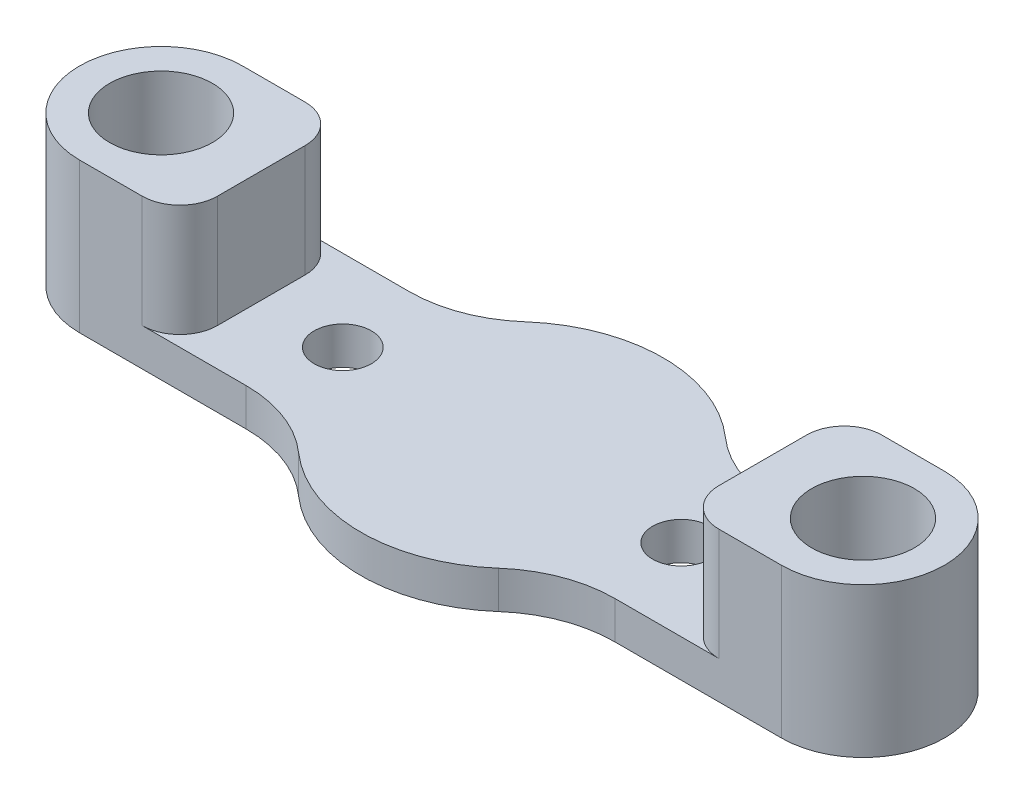
ISO-10303-21;
HEADER;
FILE_DESCRIPTION(('STEP AP214'),'2;1');
FILE_NAME('part.step','',(''),(''),'','','');
FILE_SCHEMA(('AUTOMOTIVE_DESIGN { 1 0 10303 214 1 1 1 1 }'));
ENDSEC;
DATA;
#1=APPLICATION_CONTEXT('core data for automotive mechanical design processes');
#2=APPLICATION_PROTOCOL_DEFINITION('international standard','automotive_design',2000,#1);
#3=PRODUCT_CONTEXT('',#1,'mechanical');
#4=PRODUCT('Part','Part','',(#3));
#5=PRODUCT_RELATED_PRODUCT_CATEGORY('part','',(#4));
#6=PRODUCT_DEFINITION_FORMATION('','',#4);
#7=PRODUCT_DEFINITION_CONTEXT('part definition',#1,'design');
#8=PRODUCT_DEFINITION('design','',#6,#7);
#9=PRODUCT_DEFINITION_SHAPE('','',#8);
#10=(LENGTH_UNIT() NAMED_UNIT(*) SI_UNIT(.MILLI.,.METRE.));
#11=(NAMED_UNIT(*) PLANE_ANGLE_UNIT() SI_UNIT($,.RADIAN.));
#12=(NAMED_UNIT(*) SI_UNIT($,.STERADIAN.) SOLID_ANGLE_UNIT());
#13=UNCERTAINTY_MEASURE_WITH_UNIT(LENGTH_MEASURE(1.E-05),#10,'distance_accuracy_value','');
#14=(GEOMETRIC_REPRESENTATION_CONTEXT(3) GLOBAL_UNCERTAINTY_ASSIGNED_CONTEXT((#13)) GLOBAL_UNIT_ASSIGNED_CONTEXT((#10,
#11,#12)) REPRESENTATION_CONTEXT('',''));
#15=CARTESIAN_POINT('',(0.,0.,0.));
#16=DIRECTION('',(0.,0.,1.));
#17=DIRECTION('',(1.,0.,0.));
#18=AXIS2_PLACEMENT_3D('',#15,#16,#17);
#19=CARTESIAN_POINT('',(-14.,1.5,0.));
#20=DIRECTION('',(0.,1.,0.));
#21=DIRECTION('',(0.,0.,1.));
#22=AXIS2_PLACEMENT_3D('',#19,#20,#21);
#23=PLANE('',#22);
#24=CARTESIAN_POINT('',(-6.75000000000003,1.5,0.));
#25=DIRECTION('',(0.,1.,0.));
#26=DIRECTION('',(0.,0.,1.));
#27=AXIS2_PLACEMENT_3D('',#24,#25,#26);
#28=CIRCLE('',#27,1.14);
#29=CARTESIAN_POINT('',(-6.75000000000003,1.5,1.14));
#30=VERTEX_POINT('',#29);
#31=EDGE_CURVE('E242',#30,#30,#28,.T.);
#32=ORIENTED_EDGE('',*,*,#31,.F.);
#33=EDGE_LOOP('',(#32));
#34=FACE_BOUND('',#33,.T.);
#35=CARTESIAN_POINT('',(6.75000000000003,1.5,0.));
#36=DIRECTION('',(0.,1.,0.));
#37=DIRECTION('',(0.,0.,-1.));
#38=AXIS2_PLACEMENT_3D('',#35,#36,#37);
#39=CIRCLE('',#38,1.14);
#40=CARTESIAN_POINT('',(6.75000000000003,1.5,-1.14));
#41=VERTEX_POINT('',#40);
#42=EDGE_CURVE('E236',#41,#41,#39,.T.);
#43=ORIENTED_EDGE('',*,*,#42,.F.);
#44=EDGE_LOOP('',(#43));
#45=FACE_BOUND('',#44,.T.);
#46=DIRECTION('',(1.,0.,0.));
#47=VECTOR('',#46,1.);
#48=CARTESIAN_POINT('',(7.35140802839837,1.5,3.25));
#49=LINE('',#48,#47);
#50=CARTESIAN_POINT('',(7.35140802839837,1.5,3.25));
#51=VERTEX_POINT('',#50);
#52=CARTESIAN_POINT('',(11.5,1.5,3.25));
#53=VERTEX_POINT('',#52);
#54=EDGE_CURVE('E260',#51,#53,#49,.T.);
#55=ORIENTED_EDGE('',*,*,#54,.T.);
#56=CARTESIAN_POINT('',(11.5,1.5,1.75));
#57=DIRECTION('',(0.,1.,0.));
#58=DIRECTION('',(0.,0.,1.));
#59=AXIS2_PLACEMENT_3D('',#56,#57,#58);
#60=CIRCLE('',#59,1.5);
#61=CARTESIAN_POINT('',(10.,1.5,1.75));
#62=VERTEX_POINT('',#61);
#63=EDGE_CURVE('E347',#53,#62,#60,.F.);
#64=ORIENTED_EDGE('',*,*,#63,.T.);
#65=DIRECTION('',(0.,0.,1.));
#66=VECTOR('',#65,1.);
#67=CARTESIAN_POINT('',(10.,1.5,-3.25));
#68=LINE('',#67,#66);
#69=CARTESIAN_POINT('',(10.,1.5,-1.75));
#70=VERTEX_POINT('',#69);
#71=EDGE_CURVE('E205',#70,#62,#68,.T.);
#72=ORIENTED_EDGE('',*,*,#71,.F.);
#73=CARTESIAN_POINT('',(11.5,1.5,-1.75));
#74=DIRECTION('',(0.,1.,0.));
#75=DIRECTION('',(0.,0.,1.));
#76=AXIS2_PLACEMENT_3D('',#73,#74,#75);
#77=CIRCLE('',#76,1.5);
#78=CARTESIAN_POINT('',(11.5,1.5,-3.25));
#79=VERTEX_POINT('',#78);
#80=EDGE_CURVE('E349',#70,#79,#77,.F.);
#81=ORIENTED_EDGE('',*,*,#80,.T.);
#82=DIRECTION('',(-1.,0.,0.));
#83=VECTOR('',#82,1.);
#84=CARTESIAN_POINT('',(7.35140802839837,1.5,-3.25));
#85=LINE('',#84,#83);
#86=CARTESIAN_POINT('',(7.35140802839837,1.5,-3.25));
#87=VERTEX_POINT('',#86);
#88=EDGE_CURVE('E262',#79,#87,#85,.T.);
#89=ORIENTED_EDGE('',*,*,#88,.T.);
#90=CARTESIAN_POINT('',(7.35140802839837,1.5,-8.33));
#91=DIRECTION('',(0.,-1.,0.));
#92=DIRECTION('',(0.,0.,-1.));
#93=AXIS2_PLACEMENT_3D('',#90,#91,#92);
#94=CIRCLE('',#93,5.08);
#95=CARTESIAN_POINT('',(3.99000813782558,1.5,-4.52114311431143));
#96=VERTEX_POINT('',#95);
#97=EDGE_CURVE('E264',#87,#96,#94,.T.);
#98=ORIENTED_EDGE('',*,*,#97,.T.);
#99=CARTESIAN_POINT('',(0.,1.5,0.));
#100=DIRECTION('',(0.,1.,0.));
#101=DIRECTION('',(0.,0.,1.));
#102=AXIS2_PLACEMENT_3D('',#99,#100,#101);
#103=CIRCLE('',#102,6.03);
#104=CARTESIAN_POINT('',(-3.99000813782558,1.5,-4.52114311431143));
#105=VERTEX_POINT('',#104);
#106=EDGE_CURVE('E266',#96,#105,#103,.T.);
#107=ORIENTED_EDGE('',*,*,#106,.T.);
#108=CARTESIAN_POINT('',(-7.35140802839837,1.5,-8.33));
#109=DIRECTION('',(0.,-1.,0.));
#110=DIRECTION('',(0.,0.,1.));
#111=AXIS2_PLACEMENT_3D('',#108,#109,#110);
#112=CIRCLE('',#111,5.08);
#113=CARTESIAN_POINT('',(-7.35140802839837,1.5,-3.25));
#114=VERTEX_POINT('',#113);
#115=EDGE_CURVE('E268',#105,#114,#112,.T.);
#116=ORIENTED_EDGE('',*,*,#115,.T.);
#117=DIRECTION('',(-1.,0.,0.));
#118=VECTOR('',#117,1.);
#119=CARTESIAN_POINT('',(-7.35140802839837,1.5,-3.25));
#120=LINE('',#119,#118);
#121=CARTESIAN_POINT('',(-11.5,1.5,-3.25));
#122=VERTEX_POINT('',#121);
#123=EDGE_CURVE('E53',#114,#122,#120,.T.);
#124=ORIENTED_EDGE('',*,*,#123,.T.);
#125=CARTESIAN_POINT('',(-11.5,1.5,-1.75));
#126=DIRECTION('',(0.,1.,0.));
#127=DIRECTION('',(0.,0.,1.));
#128=AXIS2_PLACEMENT_3D('',#125,#126,#127);
#129=CIRCLE('',#128,1.5);
#130=CARTESIAN_POINT('',(-10.,1.5,-1.75));
#131=VERTEX_POINT('',#130);
#132=EDGE_CURVE('E11',#122,#131,#129,.F.);
#133=ORIENTED_EDGE('',*,*,#132,.T.);
#134=DIRECTION('',(0.,0.,-1.));
#135=VECTOR('',#134,1.);
#136=CARTESIAN_POINT('',(-10.,1.5,-3.25));
#137=LINE('',#136,#135);
#138=CARTESIAN_POINT('',(-10.,1.5,1.75));
#139=VERTEX_POINT('',#138);
#140=EDGE_CURVE('E219',#139,#131,#137,.T.);
#141=ORIENTED_EDGE('',*,*,#140,.F.);
#142=CARTESIAN_POINT('',(-11.5,1.5,1.75));
#143=DIRECTION('',(0.,1.,0.));
#144=DIRECTION('',(0.,0.,1.));
#145=AXIS2_PLACEMENT_3D('',#142,#143,#144);
#146=CIRCLE('',#145,1.5);
#147=CARTESIAN_POINT('',(-11.5,1.5,3.25));
#148=VERTEX_POINT('',#147);
#149=EDGE_CURVE('E47',#139,#148,#146,.F.);
#150=ORIENTED_EDGE('',*,*,#149,.T.);
#151=DIRECTION('',(1.,0.,0.));
#152=VECTOR('',#151,1.);
#153=CARTESIAN_POINT('',(-7.35140802839837,1.5,3.25));
#154=LINE('',#153,#152);
#155=CARTESIAN_POINT('',(-7.35140802839837,1.5,3.25));
#156=VERTEX_POINT('',#155);
#157=EDGE_CURVE('E251',#148,#156,#154,.T.);
#158=ORIENTED_EDGE('',*,*,#157,.T.);
#159=CARTESIAN_POINT('',(-7.35140802839837,1.5,8.33));
#160=DIRECTION('',(0.,-1.,0.));
#161=DIRECTION('',(0.,0.,-1.));
#162=AXIS2_PLACEMENT_3D('',#159,#160,#161);
#163=CIRCLE('',#162,5.08);
#164=CARTESIAN_POINT('',(-3.99000813782558,1.5,4.52114311431143));
#165=VERTEX_POINT('',#164);
#166=EDGE_CURVE('E253',#156,#165,#163,.T.);
#167=ORIENTED_EDGE('',*,*,#166,.T.);
#168=CARTESIAN_POINT('',(0.,1.5,0.));
#169=DIRECTION('',(0.,1.,0.));
#170=DIRECTION('',(0.,0.,-1.));
#171=AXIS2_PLACEMENT_3D('',#168,#169,#170);
#172=CIRCLE('',#171,6.03);
#173=CARTESIAN_POINT('',(3.99000813782558,1.5,4.52114311431143));
#174=VERTEX_POINT('',#173);
#175=EDGE_CURVE('E256',#165,#174,#172,.T.);
#176=ORIENTED_EDGE('',*,*,#175,.T.);
#177=CARTESIAN_POINT('',(7.35140802839837,1.5,8.33));
#178=DIRECTION('',(0.,-1.,0.));
#179=DIRECTION('',(0.,0.,1.));
#180=AXIS2_PLACEMENT_3D('',#177,#178,#179);
#181=CIRCLE('',#180,5.08);
#182=EDGE_CURVE('E258',#174,#51,#181,.T.);
#183=ORIENTED_EDGE('',*,*,#182,.T.);
#184=EDGE_LOOP('',(#55,#64,#72,#81,#89,#98,#107,#116,#124,#133,#141,#150,#158,#167,#176,#183));
#185=FACE_BOUND('',#184,.T.);
#186=ADVANCED_FACE('F39',(#34,#45,#185),#23,.T.);
#187=CARTESIAN_POINT('',(-14.,0.,0.));
#188=DIRECTION('',(0.,1.,0.));
#189=DIRECTION('',(0.,0.,1.));
#190=AXIS2_PLACEMENT_3D('',#187,#188,#189);
#191=PLANE('',#190);
#192=CARTESIAN_POINT('',(-14.,0.,0.));
#193=DIRECTION('',(0.,1.,0.));
#194=DIRECTION('',(0.,0.,1.));
#195=AXIS2_PLACEMENT_3D('',#192,#193,#194);
#196=CIRCLE('',#195,3.25);
#197=CARTESIAN_POINT('',(-14.,0.,-3.25));
#198=VERTEX_POINT('',#197);
#199=CARTESIAN_POINT('',(-14.,0.,3.25));
#200=VERTEX_POINT('',#199);
#201=EDGE_CURVE('E250',#198,#200,#196,.T.);
#202=ORIENTED_EDGE('',*,*,#201,.F.);
#203=DIRECTION('',(-1.,0.,0.));
#204=VECTOR('',#203,1.);
#205=CARTESIAN_POINT('',(-7.35140802839837,0.,-3.25));
#206=LINE('',#205,#204);
#207=CARTESIAN_POINT('',(-7.35140802839837,0.,-3.25));
#208=VERTEX_POINT('',#207);
#209=EDGE_CURVE('E254',#208,#198,#206,.T.);
#210=ORIENTED_EDGE('',*,*,#209,.F.);
#211=CARTESIAN_POINT('',(-7.35140802839837,0.,-8.33));
#212=DIRECTION('',(0.,-1.,0.));
#213=DIRECTION('',(0.,0.,1.));
#214=AXIS2_PLACEMENT_3D('',#211,#212,#213);
#215=CIRCLE('',#214,5.08);
#216=CARTESIAN_POINT('',(-3.99000813782558,0.,-4.52114311431143));
#217=VERTEX_POINT('',#216);
#218=EDGE_CURVE('E291',#217,#208,#215,.T.);
#219=ORIENTED_EDGE('',*,*,#218,.F.);
#220=CARTESIAN_POINT('',(0.,0.,0.));
#221=DIRECTION('',(0.,1.,0.));
#222=DIRECTION('',(0.,0.,1.));
#223=AXIS2_PLACEMENT_3D('',#220,#221,#222);
#224=CIRCLE('',#223,6.03);
#225=CARTESIAN_POINT('',(3.99000813782558,0.,-4.52114311431143));
#226=VERTEX_POINT('',#225);
#227=EDGE_CURVE('E289',#226,#217,#224,.T.);
#228=ORIENTED_EDGE('',*,*,#227,.F.);
#229=CARTESIAN_POINT('',(7.35140802839837,0.,-8.33));
#230=DIRECTION('',(0.,-1.,0.));
#231=DIRECTION('',(0.,0.,-1.));
#232=AXIS2_PLACEMENT_3D('',#229,#230,#231);
#233=CIRCLE('',#232,5.08);
#234=CARTESIAN_POINT('',(7.35140802839837,0.,-3.25));
#235=VERTEX_POINT('',#234);
#236=EDGE_CURVE('E287',#235,#226,#233,.T.);
#237=ORIENTED_EDGE('',*,*,#236,.F.);
#238=DIRECTION('',(-1.,0.,0.));
#239=VECTOR('',#238,1.);
#240=CARTESIAN_POINT('',(7.35140802839837,0.,-3.25));
#241=LINE('',#240,#239);
#242=CARTESIAN_POINT('',(14.,0.,-3.25));
#243=VERTEX_POINT('',#242);
#244=EDGE_CURVE('E285',#243,#235,#241,.T.);
#245=ORIENTED_EDGE('',*,*,#244,.F.);
#246=CARTESIAN_POINT('',(14.,0.,0.));
#247=DIRECTION('',(0.,1.,0.));
#248=DIRECTION('',(0.,0.,-1.));
#249=AXIS2_PLACEMENT_3D('',#246,#247,#248);
#250=CIRCLE('',#249,3.25);
#251=CARTESIAN_POINT('',(14.,0.,3.25));
#252=VERTEX_POINT('',#251);
#253=EDGE_CURVE('E283',#252,#243,#250,.T.);
#254=ORIENTED_EDGE('',*,*,#253,.F.);
#255=DIRECTION('',(1.,0.,0.));
#256=VECTOR('',#255,1.);
#257=CARTESIAN_POINT('',(7.35140802839837,0.,3.25));
#258=LINE('',#257,#256);
#259=CARTESIAN_POINT('',(7.35140802839837,0.,3.25));
#260=VERTEX_POINT('',#259);
#261=EDGE_CURVE('E196',#260,#252,#258,.T.);
#262=ORIENTED_EDGE('',*,*,#261,.F.);
#263=CARTESIAN_POINT('',(7.35140802839837,0.,8.33));
#264=DIRECTION('',(0.,-1.,0.));
#265=DIRECTION('',(0.,0.,1.));
#266=AXIS2_PLACEMENT_3D('',#263,#264,#265);
#267=CIRCLE('',#266,5.08);
#268=CARTESIAN_POINT('',(3.99000813782558,0.,4.52114311431143));
#269=VERTEX_POINT('',#268);
#270=EDGE_CURVE('E280',#269,#260,#267,.T.);
#271=ORIENTED_EDGE('',*,*,#270,.F.);
#272=CARTESIAN_POINT('',(0.,0.,0.));
#273=DIRECTION('',(0.,1.,0.));
#274=DIRECTION('',(0.,0.,-1.));
#275=AXIS2_PLACEMENT_3D('',#272,#273,#274);
#276=CIRCLE('',#275,6.03);
#277=CARTESIAN_POINT('',(-3.99000813782558,0.,4.52114311431143));
#278=VERTEX_POINT('',#277);
#279=EDGE_CURVE('E278',#278,#269,#276,.T.);
#280=ORIENTED_EDGE('',*,*,#279,.F.);
#281=CARTESIAN_POINT('',(-7.35140802839837,0.,8.33));
#282=DIRECTION('',(0.,-1.,0.));
#283=DIRECTION('',(0.,0.,-1.));
#284=AXIS2_PLACEMENT_3D('',#281,#282,#283);
#285=CIRCLE('',#284,5.08);
#286=CARTESIAN_POINT('',(-7.35140802839837,0.,3.25));
#287=VERTEX_POINT('',#286);
#288=EDGE_CURVE('E276',#287,#278,#285,.T.);
#289=ORIENTED_EDGE('',*,*,#288,.F.);
#290=DIRECTION('',(1.,0.,0.));
#291=VECTOR('',#290,1.);
#292=CARTESIAN_POINT('',(-7.35140802839837,0.,3.25));
#293=LINE('',#292,#291);
#294=EDGE_CURVE('E274',#200,#287,#293,.T.);
#295=ORIENTED_EDGE('',*,*,#294,.F.);
#296=EDGE_LOOP('',(#202,#210,#219,#228,#237,#245,#254,#262,#271,#280,#289,#295));
#297=FACE_BOUND('',#296,.T.);
#298=CARTESIAN_POINT('',(-14.,0.,0.));
#299=DIRECTION('',(0.,1.,0.));
#300=DIRECTION('',(0.,0.,1.));
#301=AXIS2_PLACEMENT_3D('',#298,#299,#300);
#302=CIRCLE('',#301,2.05);
#303=CARTESIAN_POINT('',(-14.,0.,2.05));
#304=VERTEX_POINT('',#303);
#305=EDGE_CURVE('E245',#304,#304,#302,.T.);
#306=ORIENTED_EDGE('',*,*,#305,.T.);
#307=EDGE_LOOP('',(#306));
#308=FACE_BOUND('',#307,.T.);
#309=CARTESIAN_POINT('',(-6.75000000000003,0.,0.));
#310=DIRECTION('',(0.,1.,0.));
#311=DIRECTION('',(0.,0.,1.));
#312=AXIS2_PLACEMENT_3D('',#309,#310,#311);
#313=CIRCLE('',#312,1.14);
#314=CARTESIAN_POINT('',(-6.75000000000003,0.,1.14));
#315=VERTEX_POINT('',#314);
#316=EDGE_CURVE('E239',#315,#315,#313,.T.);
#317=ORIENTED_EDGE('',*,*,#316,.T.);
#318=EDGE_LOOP('',(#317));
#319=FACE_BOUND('',#318,.T.);
#320=CARTESIAN_POINT('',(6.75000000000003,0.,0.));
#321=DIRECTION('',(0.,1.,0.));
#322=DIRECTION('',(0.,0.,-1.));
#323=AXIS2_PLACEMENT_3D('',#320,#321,#322);
#324=CIRCLE('',#323,1.14);
#325=CARTESIAN_POINT('',(6.75000000000003,0.,-1.14));
#326=VERTEX_POINT('',#325);
#327=EDGE_CURVE('E235',#326,#326,#324,.T.);
#328=ORIENTED_EDGE('',*,*,#327,.T.);
#329=EDGE_LOOP('',(#328));
#330=FACE_BOUND('',#329,.T.);
#331=CARTESIAN_POINT('',(14.,0.,0.));
#332=DIRECTION('',(0.,1.,0.));
#333=DIRECTION('',(0.,0.,-1.));
#334=AXIS2_PLACEMENT_3D('',#331,#332,#333);
#335=CIRCLE('',#334,2.05000000000001);
#336=CARTESIAN_POINT('',(14.,0.,-2.05000000000001));
#337=VERTEX_POINT('',#336);
#338=EDGE_CURVE('E230',#337,#337,#335,.T.);
#339=ORIENTED_EDGE('',*,*,#338,.T.);
#340=EDGE_LOOP('',(#339));
#341=FACE_BOUND('',#340,.T.);
#342=ADVANCED_FACE('F377',(#297,#308,#319,#330,#341),#191,.F.);
#343=CARTESIAN_POINT('',(-14.,1.5,0.));
#344=DIRECTION('',(0.,-1.,0.));
#345=DIRECTION('',(0.,0.,-1.));
#346=AXIS2_PLACEMENT_3D('',#343,#344,#345);
#347=CYLINDRICAL_SURFACE('',#346,3.25);
#348=ORIENTED_EDGE('',*,*,#201,.T.);
#349=DIRECTION('',(0.,-1.,0.));
#350=VECTOR('',#349,1.);
#351=CARTESIAN_POINT('',(-14.,1.5,3.25));
#352=LINE('',#351,#350);
#353=CARTESIAN_POINT('',(-14.,5.97,3.25));
#354=VERTEX_POINT('',#353);
#355=EDGE_CURVE('E319',#354,#200,#352,.T.);
#356=ORIENTED_EDGE('',*,*,#355,.F.);
#357=CARTESIAN_POINT('',(-14.,5.97,0.));
#358=DIRECTION('',(0.,1.,0.));
#359=DIRECTION('',(0.,0.,1.));
#360=AXIS2_PLACEMENT_3D('',#357,#358,#359);
#361=CIRCLE('',#360,3.25);
#362=CARTESIAN_POINT('',(-14.,5.97,-3.25));
#363=VERTEX_POINT('',#362);
#364=EDGE_CURVE('E220',#363,#354,#361,.T.);
#365=ORIENTED_EDGE('',*,*,#364,.F.);
#366=DIRECTION('',(0.,-1.,0.));
#367=VECTOR('',#366,1.);
#368=CARTESIAN_POINT('',(-14.,1.5,-3.25));
#369=LINE('',#368,#367);
#370=EDGE_CURVE('E271',#363,#198,#369,.T.);
#371=ORIENTED_EDGE('',*,*,#370,.T.);
#372=EDGE_LOOP('',(#348,#356,#365,#371));
#373=FACE_BOUND('',#372,.T.);
#374=ADVANCED_FACE('F368',(#373),#347,.T.);
#375=CARTESIAN_POINT('',(-7.35140802839837,1.5,3.25));
#376=DIRECTION('',(0.,0.,-1.));
#377=DIRECTION('',(-1.,0.,0.));
#378=AXIS2_PLACEMENT_3D('',#375,#376,#377);
#379=PLANE('',#378);
#380=ORIENTED_EDGE('',*,*,#157,.F.);
#381=DIRECTION('',(0.,-1.,0.));
#382=VECTOR('',#381,1.);
#383=CARTESIAN_POINT('',(-11.5,1.5,3.25));
#384=LINE('',#383,#382);
#385=CARTESIAN_POINT('',(-11.5,5.97,3.25));
#386=VERTEX_POINT('',#385);
#387=EDGE_CURVE('E339',#148,#386,#384,.F.);
#388=ORIENTED_EDGE('',*,*,#387,.T.);
#389=DIRECTION('',(1.,0.,0.));
#390=VECTOR('',#389,1.);
#391=CARTESIAN_POINT('',(-10.,5.97,3.25));
#392=LINE('',#391,#390);
#393=EDGE_CURVE('E223',#354,#386,#392,.T.);
#394=ORIENTED_EDGE('',*,*,#393,.F.);
#395=ORIENTED_EDGE('',*,*,#355,.T.);
#396=ORIENTED_EDGE('',*,*,#294,.T.);
#397=DIRECTION('',(0.,-1.,0.));
#398=VECTOR('',#397,1.);
#399=CARTESIAN_POINT('',(-7.35140802839837,1.5,3.25));
#400=LINE('',#399,#398);
#401=EDGE_CURVE('E316',#156,#287,#400,.T.);
#402=ORIENTED_EDGE('',*,*,#401,.F.);
#403=EDGE_LOOP('',(#380,#388,#394,#395,#396,#402));
#404=FACE_BOUND('',#403,.T.);
#405=ADVANCED_FACE('F361',(#404),#379,.F.);
#406=CARTESIAN_POINT('',(-7.35140802839837,1.5,8.33));
#407=DIRECTION('',(0.,-1.,0.));
#408=DIRECTION('',(0.,0.,-1.));
#409=AXIS2_PLACEMENT_3D('',#406,#407,#408);
#410=CYLINDRICAL_SURFACE('',#409,5.08);
#411=ORIENTED_EDGE('',*,*,#288,.T.);
#412=DIRECTION('',(0.,-1.,0.));
#413=VECTOR('',#412,1.);
#414=CARTESIAN_POINT('',(-3.99000813782558,1.5,4.52114311431143));
#415=LINE('',#414,#413);
#416=EDGE_CURVE('E313',#165,#278,#415,.T.);
#417=ORIENTED_EDGE('',*,*,#416,.F.);
#418=ORIENTED_EDGE('',*,*,#166,.F.);
#419=ORIENTED_EDGE('',*,*,#401,.T.);
#420=EDGE_LOOP('',(#411,#417,#418,#419));
#421=FACE_BOUND('',#420,.T.);
#422=ADVANCED_FACE('F374',(#421),#410,.F.);
#423=CARTESIAN_POINT('',(0.,1.5,0.));
#424=DIRECTION('',(0.,-1.,0.));
#425=DIRECTION('',(0.,0.,-1.));
#426=AXIS2_PLACEMENT_3D('',#423,#424,#425);
#427=CYLINDRICAL_SURFACE('',#426,6.03);
#428=ORIENTED_EDGE('',*,*,#279,.T.);
#429=DIRECTION('',(0.,-1.,0.));
#430=VECTOR('',#429,1.);
#431=CARTESIAN_POINT('',(3.99000813782558,1.5,4.52114311431143));
#432=LINE('',#431,#430);
#433=EDGE_CURVE('E310',#174,#269,#432,.T.);
#434=ORIENTED_EDGE('',*,*,#433,.F.);
#435=ORIENTED_EDGE('',*,*,#175,.F.);
#436=ORIENTED_EDGE('',*,*,#416,.T.);
#437=EDGE_LOOP('',(#428,#434,#435,#436));
#438=FACE_BOUND('',#437,.T.);
#439=ADVANCED_FACE('F382',(#438),#427,.T.);
#440=CARTESIAN_POINT('',(7.35140802839837,1.5,8.33));
#441=DIRECTION('',(0.,-1.,0.));
#442=DIRECTION('',(0.,0.,-1.));
#443=AXIS2_PLACEMENT_3D('',#440,#441,#442);
#444=CYLINDRICAL_SURFACE('',#443,5.08);
#445=ORIENTED_EDGE('',*,*,#270,.T.);
#446=DIRECTION('',(0.,-1.,0.));
#447=VECTOR('',#446,1.);
#448=CARTESIAN_POINT('',(7.35140802839837,1.5,3.25));
#449=LINE('',#448,#447);
#450=EDGE_CURVE('E199',#51,#260,#449,.T.);
#451=ORIENTED_EDGE('',*,*,#450,.F.);
#452=ORIENTED_EDGE('',*,*,#182,.F.);
#453=ORIENTED_EDGE('',*,*,#433,.T.);
#454=EDGE_LOOP('',(#445,#451,#452,#453));
#455=FACE_BOUND('',#454,.T.);
#456=ADVANCED_FACE('F386',(#455),#444,.F.);
#457=CARTESIAN_POINT('',(7.35140802839837,1.5,3.25));
#458=DIRECTION('',(0.,0.,-1.));
#459=DIRECTION('',(-1.,0.,0.));
#460=AXIS2_PLACEMENT_3D('',#457,#458,#459);
#461=PLANE('',#460);
#462=DIRECTION('',(1.,0.,0.));
#463=VECTOR('',#462,1.);
#464=CARTESIAN_POINT('',(10.,5.97,3.25));
#465=LINE('',#464,#463);
#466=CARTESIAN_POINT('',(11.5,5.97,3.25));
#467=VERTEX_POINT('',#466);
#468=CARTESIAN_POINT('',(14.,5.97,3.25));
#469=VERTEX_POINT('',#468);
#470=EDGE_CURVE('E176',#467,#469,#465,.T.);
#471=ORIENTED_EDGE('',*,*,#470,.F.);
#472=DIRECTION('',(0.,-1.,0.));
#473=VECTOR('',#472,1.);
#474=CARTESIAN_POINT('',(11.5,1.5,3.25));
#475=LINE('',#474,#473);
#476=EDGE_CURVE('E322',#467,#53,#475,.T.);
#477=ORIENTED_EDGE('',*,*,#476,.T.);
#478=ORIENTED_EDGE('',*,*,#54,.F.);
#479=ORIENTED_EDGE('',*,*,#450,.T.);
#480=ORIENTED_EDGE('',*,*,#261,.T.);
#481=DIRECTION('',(0.,-1.,0.));
#482=VECTOR('',#481,1.);
#483=CARTESIAN_POINT('',(14.,1.5,3.25));
#484=LINE('',#483,#482);
#485=EDGE_CURVE('E192',#469,#252,#484,.T.);
#486=ORIENTED_EDGE('',*,*,#485,.F.);
#487=EDGE_LOOP('',(#471,#477,#478,#479,#480,#486));
#488=FACE_BOUND('',#487,.T.);
#489=ADVANCED_FACE('F193',(#488),#461,.F.);
#490=CARTESIAN_POINT('',(14.,1.5,0.));
#491=DIRECTION('',(0.,-1.,0.));
#492=DIRECTION('',(0.,0.,-1.));
#493=AXIS2_PLACEMENT_3D('',#490,#491,#492);
#494=CYLINDRICAL_SURFACE('',#493,3.25);
#495=ORIENTED_EDGE('',*,*,#253,.T.);
#496=DIRECTION('',(0.,-1.,0.));
#497=VECTOR('',#496,1.);
#498=CARTESIAN_POINT('',(14.,1.5,-3.25));
#499=LINE('',#498,#497);
#500=CARTESIAN_POINT('',(14.,5.97,-3.25));
#501=VERTEX_POINT('',#500);
#502=EDGE_CURVE('E200',#501,#243,#499,.T.);
#503=ORIENTED_EDGE('',*,*,#502,.F.);
#504=CARTESIAN_POINT('',(14.,5.97,0.));
#505=DIRECTION('',(0.,1.,0.));
#506=DIRECTION('',(0.,0.,-1.));
#507=AXIS2_PLACEMENT_3D('',#504,#505,#506);
#508=CIRCLE('',#507,3.25);
#509=EDGE_CURVE('E183',#469,#501,#508,.T.);
#510=ORIENTED_EDGE('',*,*,#509,.F.);
#511=ORIENTED_EDGE('',*,*,#485,.T.);
#512=EDGE_LOOP('',(#495,#503,#510,#511));
#513=FACE_BOUND('',#512,.T.);
#514=ADVANCED_FACE('F202',(#513),#494,.T.);
#515=CARTESIAN_POINT('',(7.35140802839837,1.5,-3.25));
#516=DIRECTION('',(0.,0.,1.));
#517=DIRECTION('',(1.,0.,0.));
#518=AXIS2_PLACEMENT_3D('',#515,#516,#517);
#519=PLANE('',#518);
#520=ORIENTED_EDGE('',*,*,#88,.F.);
#521=DIRECTION('',(0.,-1.,0.));
#522=VECTOR('',#521,1.);
#523=CARTESIAN_POINT('',(11.5,1.5,-3.25));
#524=LINE('',#523,#522);
#525=CARTESIAN_POINT('',(11.5,5.97,-3.25));
#526=VERTEX_POINT('',#525);
#527=EDGE_CURVE('E332',#79,#526,#524,.F.);
#528=ORIENTED_EDGE('',*,*,#527,.T.);
#529=DIRECTION('',(-1.,0.,0.));
#530=VECTOR('',#529,1.);
#531=CARTESIAN_POINT('',(14.,5.97,-3.25));
#532=LINE('',#531,#530);
#533=EDGE_CURVE('E206',#501,#526,#532,.T.);
#534=ORIENTED_EDGE('',*,*,#533,.F.);
#535=ORIENTED_EDGE('',*,*,#502,.T.);
#536=ORIENTED_EDGE('',*,*,#244,.T.);
#537=DIRECTION('',(0.,-1.,0.));
#538=VECTOR('',#537,1.);
#539=CARTESIAN_POINT('',(7.35140802839837,1.5,-3.25));
#540=LINE('',#539,#538);
#541=EDGE_CURVE('E305',#87,#235,#540,.T.);
#542=ORIENTED_EDGE('',*,*,#541,.F.);
#543=EDGE_LOOP('',(#520,#528,#534,#535,#536,#542));
#544=FACE_BOUND('',#543,.T.);
#545=ADVANCED_FACE('F406',(#544),#519,.F.);
#546=CARTESIAN_POINT('',(7.35140802839837,1.5,-8.33));
#547=DIRECTION('',(0.,-1.,0.));
#548=DIRECTION('',(0.,0.,-1.));
#549=AXIS2_PLACEMENT_3D('',#546,#547,#548);
#550=CYLINDRICAL_SURFACE('',#549,5.08);
#551=ORIENTED_EDGE('',*,*,#236,.T.);
#552=DIRECTION('',(0.,-1.,0.));
#553=VECTOR('',#552,1.);
#554=CARTESIAN_POINT('',(3.99000813782558,1.5,-4.52114311431143));
#555=LINE('',#554,#553);
#556=EDGE_CURVE('E302',#96,#226,#555,.T.);
#557=ORIENTED_EDGE('',*,*,#556,.F.);
#558=ORIENTED_EDGE('',*,*,#97,.F.);
#559=ORIENTED_EDGE('',*,*,#541,.T.);
#560=EDGE_LOOP('',(#551,#557,#558,#559));
#561=FACE_BOUND('',#560,.T.);
#562=ADVANCED_FACE('F410',(#561),#550,.F.);
#563=CARTESIAN_POINT('',(0.,1.5,0.));
#564=DIRECTION('',(0.,-1.,0.));
#565=DIRECTION('',(0.,0.,-1.));
#566=AXIS2_PLACEMENT_3D('',#563,#564,#565);
#567=CYLINDRICAL_SURFACE('',#566,6.03);
#568=ORIENTED_EDGE('',*,*,#227,.T.);
#569=DIRECTION('',(0.,-1.,0.));
#570=VECTOR('',#569,1.);
#571=CARTESIAN_POINT('',(-3.99000813782558,1.5,-4.52114311431143));
#572=LINE('',#571,#570);
#573=EDGE_CURVE('E299',#105,#217,#572,.T.);
#574=ORIENTED_EDGE('',*,*,#573,.F.);
#575=ORIENTED_EDGE('',*,*,#106,.F.);
#576=ORIENTED_EDGE('',*,*,#556,.T.);
#577=EDGE_LOOP('',(#568,#574,#575,#576));
#578=FACE_BOUND('',#577,.T.);
#579=ADVANCED_FACE('F415',(#578),#567,.T.);
#580=CARTESIAN_POINT('',(-7.35140802839837,1.5,-8.33));
#581=DIRECTION('',(0.,-1.,0.));
#582=DIRECTION('',(0.,0.,-1.));
#583=AXIS2_PLACEMENT_3D('',#580,#581,#582);
#584=CYLINDRICAL_SURFACE('',#583,5.08);
#585=ORIENTED_EDGE('',*,*,#218,.T.);
#586=DIRECTION('',(0.,-1.,0.));
#587=VECTOR('',#586,1.);
#588=CARTESIAN_POINT('',(-7.35140802839837,1.5,-3.25));
#589=LINE('',#588,#587);
#590=EDGE_CURVE('E296',#114,#208,#589,.T.);
#591=ORIENTED_EDGE('',*,*,#590,.F.);
#592=ORIENTED_EDGE('',*,*,#115,.F.);
#593=ORIENTED_EDGE('',*,*,#573,.T.);
#594=EDGE_LOOP('',(#585,#591,#592,#593));
#595=FACE_BOUND('',#594,.T.);
#596=ADVANCED_FACE('F419',(#595),#584,.F.);
#597=CARTESIAN_POINT('',(-7.35140802839837,1.5,-3.25));
#598=DIRECTION('',(0.,0.,1.));
#599=DIRECTION('',(1.,0.,0.));
#600=AXIS2_PLACEMENT_3D('',#597,#598,#599);
#601=PLANE('',#600);
#602=DIRECTION('',(-1.,0.,0.));
#603=VECTOR('',#602,1.);
#604=CARTESIAN_POINT('',(-14.,5.97,-3.25));
#605=LINE('',#604,#603);
#606=CARTESIAN_POINT('',(-11.5,5.97,-3.25));
#607=VERTEX_POINT('',#606);
#608=EDGE_CURVE('E228',#607,#363,#605,.T.);
#609=ORIENTED_EDGE('',*,*,#608,.F.);
#610=DIRECTION('',(0.,-1.,0.));
#611=VECTOR('',#610,1.);
#612=CARTESIAN_POINT('',(-11.5,1.5,-3.25));
#613=LINE('',#612,#611);
#614=EDGE_CURVE('E344',#607,#122,#613,.T.);
#615=ORIENTED_EDGE('',*,*,#614,.T.);
#616=ORIENTED_EDGE('',*,*,#123,.F.);
#617=ORIENTED_EDGE('',*,*,#590,.T.);
#618=ORIENTED_EDGE('',*,*,#209,.T.);
#619=ORIENTED_EDGE('',*,*,#370,.F.);
#620=EDGE_LOOP('',(#609,#615,#616,#617,#618,#619));
#621=FACE_BOUND('',#620,.T.);
#622=ADVANCED_FACE('F423',(#621),#601,.F.);
#623=CARTESIAN_POINT('',(-14.,1.5,0.));
#624=DIRECTION('',(0.,-1.,0.));
#625=DIRECTION('',(0.,0.,-1.));
#626=AXIS2_PLACEMENT_3D('',#623,#624,#625);
#627=CYLINDRICAL_SURFACE('',#626,2.05);
#628=ORIENTED_EDGE('',*,*,#305,.F.);
#629=EDGE_LOOP('',(#628));
#630=FACE_BOUND('',#629,.T.);
#631=CARTESIAN_POINT('',(-14.,5.97,0.));
#632=DIRECTION('',(0.,1.,0.));
#633=DIRECTION('',(0.,0.,1.));
#634=AXIS2_PLACEMENT_3D('',#631,#632,#633);
#635=CIRCLE('',#634,2.05);
#636=CARTESIAN_POINT('',(-14.,5.97,2.05));
#637=VERTEX_POINT('',#636);
#638=EDGE_CURVE('E216',#637,#637,#635,.T.);
#639=ORIENTED_EDGE('',*,*,#638,.T.);
#640=EDGE_LOOP('',(#639));
#641=FACE_BOUND('',#640,.T.);
#642=ADVANCED_FACE('F451',(#630,#641),#627,.F.);
#643=CARTESIAN_POINT('',(-6.75000000000003,1.5,0.));
#644=DIRECTION('',(0.,-1.,0.));
#645=DIRECTION('',(0.,0.,-1.));
#646=AXIS2_PLACEMENT_3D('',#643,#644,#645);
#647=CYLINDRICAL_SURFACE('',#646,1.14);
#648=ORIENTED_EDGE('',*,*,#31,.T.);
#649=EDGE_LOOP('',(#648));
#650=FACE_BOUND('',#649,.T.);
#651=ORIENTED_EDGE('',*,*,#316,.F.);
#652=EDGE_LOOP('',(#651));
#653=FACE_BOUND('',#652,.T.);
#654=ADVANCED_FACE('F548',(#650,#653),#647,.F.);
#655=CARTESIAN_POINT('',(6.75000000000003,1.5,0.));
#656=DIRECTION('',(0.,-1.,0.));
#657=DIRECTION('',(0.,0.,-1.));
#658=AXIS2_PLACEMENT_3D('',#655,#656,#657);
#659=CYLINDRICAL_SURFACE('',#658,1.14);
#660=ORIENTED_EDGE('',*,*,#42,.T.);
#661=EDGE_LOOP('',(#660));
#662=FACE_BOUND('',#661,.T.);
#663=ORIENTED_EDGE('',*,*,#327,.F.);
#664=EDGE_LOOP('',(#663));
#665=FACE_BOUND('',#664,.T.);
#666=ADVANCED_FACE('F535',(#662,#665),#659,.F.);
#667=CARTESIAN_POINT('',(14.,1.5,0.));
#668=DIRECTION('',(0.,-1.,0.));
#669=DIRECTION('',(0.,0.,-1.));
#670=AXIS2_PLACEMENT_3D('',#667,#668,#669);
#671=CYLINDRICAL_SURFACE('',#670,2.05000000000001);
#672=ORIENTED_EDGE('',*,*,#338,.F.);
#673=EDGE_LOOP('',(#672));
#674=FACE_BOUND('',#673,.T.);
#675=CARTESIAN_POINT('',(14.,5.97,0.));
#676=DIRECTION('',(0.,1.,0.));
#677=DIRECTION('',(0.,0.,-1.));
#678=AXIS2_PLACEMENT_3D('',#675,#676,#677);
#679=CIRCLE('',#678,2.05000000000001);
#680=CARTESIAN_POINT('',(14.,5.97,-2.05000000000001));
#681=VERTEX_POINT('',#680);
#682=EDGE_CURVE('E209',#681,#681,#679,.T.);
#683=ORIENTED_EDGE('',*,*,#682,.T.);
#684=EDGE_LOOP('',(#683));
#685=FACE_BOUND('',#684,.T.);
#686=ADVANCED_FACE('F436',(#674,#685),#671,.F.);
#687=CARTESIAN_POINT('',(-14.,5.97,0.));
#688=DIRECTION('',(0.,1.,0.));
#689=DIRECTION('',(0.,0.,1.));
#690=AXIS2_PLACEMENT_3D('',#687,#688,#689);
#691=PLANE('',#690);
#692=ORIENTED_EDGE('',*,*,#393,.T.);
#693=CARTESIAN_POINT('',(-11.5,5.97,1.75));
#694=DIRECTION('',(0.,1.,0.));
#695=DIRECTION('',(0.,0.,1.));
#696=AXIS2_PLACEMENT_3D('',#693,#694,#695);
#697=CIRCLE('',#696,1.5);
#698=CARTESIAN_POINT('',(-10.,5.97,1.75));
#699=VERTEX_POINT('',#698);
#700=EDGE_CURVE('E342',#386,#699,#697,.T.);
#701=ORIENTED_EDGE('',*,*,#700,.T.);
#702=DIRECTION('',(0.,0.,-1.));
#703=VECTOR('',#702,1.);
#704=CARTESIAN_POINT('',(-10.,5.97,-3.25));
#705=LINE('',#704,#703);
#706=CARTESIAN_POINT('',(-10.,5.97,-1.75));
#707=VERTEX_POINT('',#706);
#708=EDGE_CURVE('E226',#699,#707,#705,.T.);
#709=ORIENTED_EDGE('',*,*,#708,.T.);
#710=CARTESIAN_POINT('',(-11.5,5.97,-1.75));
#711=DIRECTION('',(0.,1.,0.));
#712=DIRECTION('',(0.,0.,1.));
#713=AXIS2_PLACEMENT_3D('',#710,#711,#712);
#714=CIRCLE('',#713,1.5);
#715=EDGE_CURVE('E61',#707,#607,#714,.T.);
#716=ORIENTED_EDGE('',*,*,#715,.T.);
#717=ORIENTED_EDGE('',*,*,#608,.T.);
#718=ORIENTED_EDGE('',*,*,#364,.T.);
#719=EDGE_LOOP('',(#692,#701,#709,#716,#717,#718));
#720=FACE_BOUND('',#719,.T.);
#721=ORIENTED_EDGE('',*,*,#638,.F.);
#722=EDGE_LOOP('',(#721));
#723=FACE_BOUND('',#722,.T.);
#724=ADVANCED_FACE('F362',(#720,#723),#691,.T.);
#725=CARTESIAN_POINT('',(-10.,5.97,-3.25));
#726=DIRECTION('',(-1.,0.,0.));
#727=DIRECTION('',(0.,0.,1.));
#728=AXIS2_PLACEMENT_3D('',#725,#726,#727);
#729=PLANE('',#728);
#730=ORIENTED_EDGE('',*,*,#708,.F.);
#731=DIRECTION('',(0.,-1.,0.));
#732=VECTOR('',#731,1.);
#733=CARTESIAN_POINT('',(-10.,5.97,1.75));
#734=LINE('',#733,#732);
#735=EDGE_CURVE('E336',#699,#139,#734,.T.);
#736=ORIENTED_EDGE('',*,*,#735,.T.);
#737=ORIENTED_EDGE('',*,*,#140,.T.);
#738=DIRECTION('',(0.,-1.,0.));
#739=VECTOR('',#738,1.);
#740=CARTESIAN_POINT('',(-10.,5.97,-1.75));
#741=LINE('',#740,#739);
#742=EDGE_CURVE('E334',#131,#707,#741,.F.);
#743=ORIENTED_EDGE('',*,*,#742,.T.);
#744=EDGE_LOOP('',(#730,#736,#737,#743));
#745=FACE_BOUND('',#744,.T.);
#746=ADVANCED_FACE('F428',(#745),#729,.F.);
#747=CARTESIAN_POINT('',(14.,5.97,0.));
#748=DIRECTION('',(0.,-1.,0.));
#749=DIRECTION('',(0.,0.,-1.));
#750=AXIS2_PLACEMENT_3D('',#747,#748,#749);
#751=PLANE('',#750);
#752=DIRECTION('',(0.,0.,1.));
#753=VECTOR('',#752,1.);
#754=CARTESIAN_POINT('',(10.,5.97,-3.25));
#755=LINE('',#754,#753);
#756=CARTESIAN_POINT('',(10.,5.97,-1.75));
#757=VERTEX_POINT('',#756);
#758=CARTESIAN_POINT('',(10.,5.97,1.75));
#759=VERTEX_POINT('',#758);
#760=EDGE_CURVE('E189',#757,#759,#755,.T.);
#761=ORIENTED_EDGE('',*,*,#760,.T.);
#762=CARTESIAN_POINT('',(11.5,5.97,1.75));
#763=DIRECTION('',(0.,-1.,0.));
#764=DIRECTION('',(0.,0.,-1.));
#765=AXIS2_PLACEMENT_3D('',#762,#763,#764);
#766=CIRCLE('',#765,1.5);
#767=EDGE_CURVE('E185',#759,#467,#766,.F.);
#768=ORIENTED_EDGE('',*,*,#767,.T.);
#769=ORIENTED_EDGE('',*,*,#470,.T.);
#770=ORIENTED_EDGE('',*,*,#509,.T.);
#771=ORIENTED_EDGE('',*,*,#533,.T.);
#772=CARTESIAN_POINT('',(11.5,5.97,-1.75));
#773=DIRECTION('',(0.,-1.,0.));
#774=DIRECTION('',(0.,0.,-1.));
#775=AXIS2_PLACEMENT_3D('',#772,#773,#774);
#776=CIRCLE('',#775,1.5);
#777=EDGE_CURVE('E329',#526,#757,#776,.F.);
#778=ORIENTED_EDGE('',*,*,#777,.T.);
#779=EDGE_LOOP('',(#761,#768,#769,#770,#771,#778));
#780=FACE_BOUND('',#779,.T.);
#781=ORIENTED_EDGE('',*,*,#682,.F.);
#782=EDGE_LOOP('',(#781));
#783=FACE_BOUND('',#782,.T.);
#784=ADVANCED_FACE('F179',(#780,#783),#751,.F.);
#785=CARTESIAN_POINT('',(10.,5.97,-3.25));
#786=DIRECTION('',(1.,0.,0.));
#787=DIRECTION('',(0.,0.,-1.));
#788=AXIS2_PLACEMENT_3D('',#785,#786,#787);
#789=PLANE('',#788);
#790=ORIENTED_EDGE('',*,*,#71,.T.);
#791=DIRECTION('',(0.,-1.,0.));
#792=VECTOR('',#791,1.);
#793=CARTESIAN_POINT('',(10.,5.97,1.75));
#794=LINE('',#793,#792);
#795=EDGE_CURVE('E327',#62,#759,#794,.F.);
#796=ORIENTED_EDGE('',*,*,#795,.T.);
#797=ORIENTED_EDGE('',*,*,#760,.F.);
#798=DIRECTION('',(0.,-1.,0.));
#799=VECTOR('',#798,1.);
#800=CARTESIAN_POINT('',(10.,5.97,-1.75));
#801=LINE('',#800,#799);
#802=EDGE_CURVE('E324',#757,#70,#801,.T.);
#803=ORIENTED_EDGE('',*,*,#802,.T.);
#804=EDGE_LOOP('',(#790,#796,#797,#803));
#805=FACE_BOUND('',#804,.T.);
#806=ADVANCED_FACE('F396',(#805),#789,.F.);
#807=CARTESIAN_POINT('',(11.5,1.5,1.75));
#808=DIRECTION('',(0.,-1.,0.));
#809=DIRECTION('',(0.,0.,-1.));
#810=AXIS2_PLACEMENT_3D('',#807,#808,#809);
#811=CYLINDRICAL_SURFACE('',#810,1.5);
#812=ORIENTED_EDGE('',*,*,#767,.F.);
#813=ORIENTED_EDGE('',*,*,#795,.F.);
#814=ORIENTED_EDGE('',*,*,#63,.F.);
#815=ORIENTED_EDGE('',*,*,#476,.F.);
#816=EDGE_LOOP('',(#812,#813,#814,#815));
#817=FACE_BOUND('',#816,.T.);
#818=ADVANCED_FACE('F393',(#817),#811,.T.);
#819=CARTESIAN_POINT('',(11.5,5.97,-1.75));
#820=DIRECTION('',(0.,-1.,0.));
#821=DIRECTION('',(0.,0.,-1.));
#822=AXIS2_PLACEMENT_3D('',#819,#820,#821);
#823=CYLINDRICAL_SURFACE('',#822,1.5);
#824=ORIENTED_EDGE('',*,*,#777,.F.);
#825=ORIENTED_EDGE('',*,*,#527,.F.);
#826=ORIENTED_EDGE('',*,*,#80,.F.);
#827=ORIENTED_EDGE('',*,*,#802,.F.);
#828=EDGE_LOOP('',(#824,#825,#826,#827));
#829=FACE_BOUND('',#828,.T.);
#830=ADVANCED_FACE('F401',(#829),#823,.T.);
#831=CARTESIAN_POINT('',(-11.5,5.97,1.75));
#832=DIRECTION('',(0.,-1.,0.));
#833=DIRECTION('',(0.,0.,-1.));
#834=AXIS2_PLACEMENT_3D('',#831,#832,#833);
#835=CYLINDRICAL_SURFACE('',#834,1.5);
#836=ORIENTED_EDGE('',*,*,#700,.F.);
#837=ORIENTED_EDGE('',*,*,#387,.F.);
#838=ORIENTED_EDGE('',*,*,#149,.F.);
#839=ORIENTED_EDGE('',*,*,#735,.F.);
#840=EDGE_LOOP('',(#836,#837,#838,#839));
#841=FACE_BOUND('',#840,.T.);
#842=ADVANCED_FACE('F358',(#841),#835,.T.);
#843=CARTESIAN_POINT('',(-11.5,1.5,-1.75));
#844=DIRECTION('',(0.,-1.,0.));
#845=DIRECTION('',(0.,0.,-1.));
#846=AXIS2_PLACEMENT_3D('',#843,#844,#845);
#847=CYLINDRICAL_SURFACE('',#846,1.5);
#848=ORIENTED_EDGE('',*,*,#715,.F.);
#849=ORIENTED_EDGE('',*,*,#742,.F.);
#850=ORIENTED_EDGE('',*,*,#132,.F.);
#851=ORIENTED_EDGE('',*,*,#614,.F.);
#852=EDGE_LOOP('',(#848,#849,#850,#851));
#853=FACE_BOUND('',#852,.T.);
#854=ADVANCED_FACE('F41',(#853),#847,.T.);
#855=CLOSED_SHELL('',(#186,#342,#374,#405,#422,#439,#456,#489,#514,#545,#562,#579,#596,#622,
#642,#654,#666,#686,#724,#746,#784,#806,#818,#830,#842,#854));
#856=MANIFOLD_SOLID_BREP('B2',#855);
#857=ADVANCED_BREP_SHAPE_REPRESENTATION('',(#18,#856),#14);
#858=SHAPE_DEFINITION_REPRESENTATION(#9,#857);
ENDSEC;
END-ISO-10303-21;
